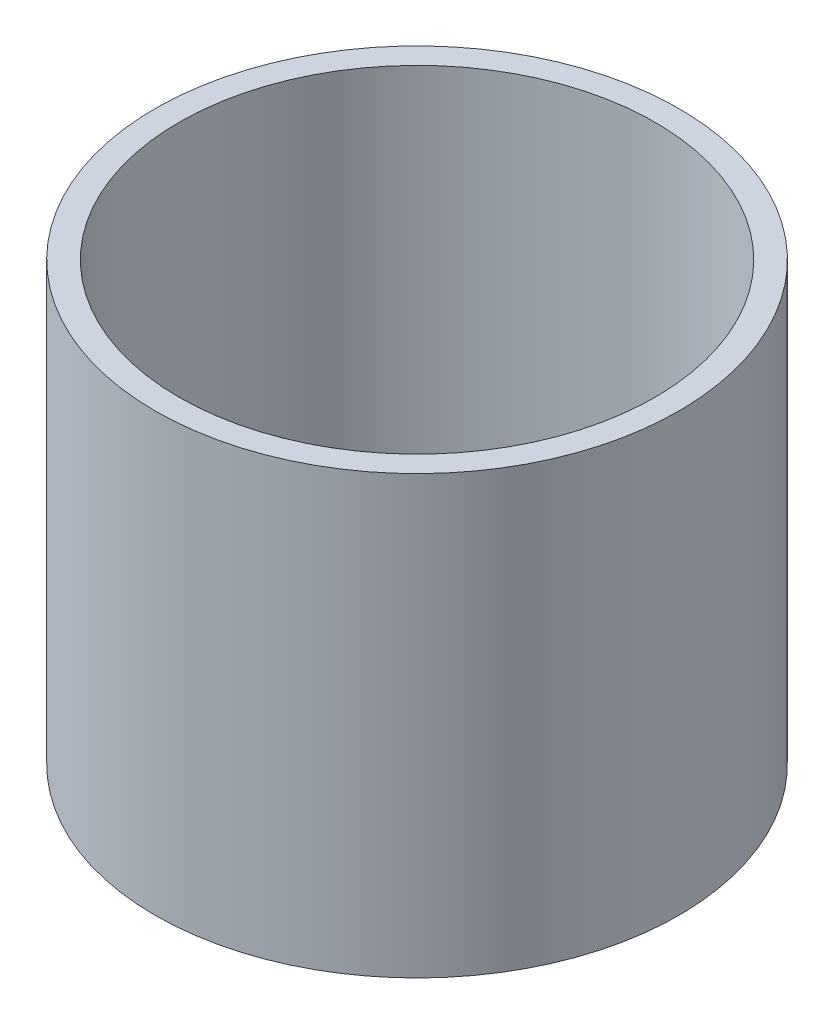
ISO-10303-21;
HEADER;
FILE_DESCRIPTION(('STEP AP214'),'2;1');
FILE_NAME('part.step','',(''),(''),'','','');
FILE_SCHEMA(('AUTOMOTIVE_DESIGN { 1 0 10303 214 1 1 1 1 }'));
ENDSEC;
DATA;
#1=APPLICATION_CONTEXT('core data for automotive mechanical design processes');
#2=APPLICATION_PROTOCOL_DEFINITION('international standard','automotive_design',2000,#1);
#3=PRODUCT_CONTEXT('',#1,'mechanical');
#4=PRODUCT('Part','Part','',(#3));
#5=PRODUCT_RELATED_PRODUCT_CATEGORY('part','',(#4));
#6=PRODUCT_DEFINITION_FORMATION('','',#4);
#7=PRODUCT_DEFINITION_CONTEXT('part definition',#1,'design');
#8=PRODUCT_DEFINITION('design','',#6,#7);
#9=PRODUCT_DEFINITION_SHAPE('','',#8);
#10=(LENGTH_UNIT() NAMED_UNIT(*) SI_UNIT(.MILLI.,.METRE.));
#11=(NAMED_UNIT(*) PLANE_ANGLE_UNIT() SI_UNIT($,.RADIAN.));
#12=(NAMED_UNIT(*) SI_UNIT($,.STERADIAN.) SOLID_ANGLE_UNIT());
#13=UNCERTAINTY_MEASURE_WITH_UNIT(LENGTH_MEASURE(1.E-05),#10,'distance_accuracy_value','');
#14=(GEOMETRIC_REPRESENTATION_CONTEXT(3) GLOBAL_UNCERTAINTY_ASSIGNED_CONTEXT((#13)) GLOBAL_UNIT_ASSIGNED_CONTEXT((#10,
#11,#12)) REPRESENTATION_CONTEXT('',''));
#15=CARTESIAN_POINT('',(0.,0.,0.));
#16=DIRECTION('',(0.,0.,1.));
#17=DIRECTION('',(1.,0.,0.));
#18=AXIS2_PLACEMENT_3D('',#15,#16,#17);
#19=CARTESIAN_POINT('',(0.,46.6,0.));
#20=DIRECTION('',(0.,1.,0.));
#21=DIRECTION('',(0.,0.,1.));
#22=AXIS2_PLACEMENT_3D('',#19,#20,#21);
#23=PLANE('',#22);
#24=CARTESIAN_POINT('',(0.,46.6,0.));
#25=DIRECTION('',(0.,1.,0.));
#26=DIRECTION('',(0.,0.,1.));
#27=AXIS2_PLACEMENT_3D('',#24,#25,#26);
#28=CIRCLE('',#27,27.94);
#29=CARTESIAN_POINT('',(0.,46.6,27.94));
#30=VERTEX_POINT('',#29);
#31=EDGE_CURVE('E10',#30,#30,#28,.T.);
#32=ORIENTED_EDGE('',*,*,#31,.T.);
#33=EDGE_LOOP('',(#32));
#34=FACE_BOUND('',#33,.T.);
#35=CARTESIAN_POINT('',(0.,46.6,0.));
#36=DIRECTION('',(0.,1.,0.));
#37=DIRECTION('',(0.,0.,1.));
#38=AXIS2_PLACEMENT_3D('',#35,#36,#37);
#39=CIRCLE('',#38,25.4);
#40=CARTESIAN_POINT('',(0.,46.6,25.4));
#41=VERTEX_POINT('',#40);
#42=EDGE_CURVE('E42',#41,#41,#39,.T.);
#43=ORIENTED_EDGE('',*,*,#42,.F.);
#44=EDGE_LOOP('',(#43));
#45=FACE_BOUND('',#44,.T.);
#46=ADVANCED_FACE('F31',(#34,#45),#23,.T.);
#47=CARTESIAN_POINT('',(0.,0.,0.));
#48=DIRECTION('',(0.,1.,0.));
#49=DIRECTION('',(0.,0.,1.));
#50=AXIS2_PLACEMENT_3D('',#47,#48,#49);
#51=PLANE('',#50);
#52=CARTESIAN_POINT('',(0.,0.,0.));
#53=DIRECTION('',(0.,1.,0.));
#54=DIRECTION('',(0.,0.,1.));
#55=AXIS2_PLACEMENT_3D('',#52,#53,#54);
#56=CIRCLE('',#55,27.94);
#57=CARTESIAN_POINT('',(0.,0.,27.94));
#58=VERTEX_POINT('',#57);
#59=EDGE_CURVE('E35',#58,#58,#56,.T.);
#60=ORIENTED_EDGE('',*,*,#59,.F.);
#61=EDGE_LOOP('',(#60));
#62=FACE_BOUND('',#61,.T.);
#63=CARTESIAN_POINT('',(0.,0.,0.));
#64=DIRECTION('',(0.,1.,0.));
#65=DIRECTION('',(0.,0.,1.));
#66=AXIS2_PLACEMENT_3D('',#63,#64,#65);
#67=CIRCLE('',#66,25.4);
#68=CARTESIAN_POINT('',(0.,0.,25.4));
#69=VERTEX_POINT('',#68);
#70=EDGE_CURVE('E44',#69,#69,#67,.T.);
#71=ORIENTED_EDGE('',*,*,#70,.T.);
#72=EDGE_LOOP('',(#71));
#73=FACE_BOUND('',#72,.T.);
#74=ADVANCED_FACE('F54',(#62,#73),#51,.F.);
#75=CARTESIAN_POINT('',(0.,46.6,0.));
#76=DIRECTION('',(0.,-1.,0.));
#77=DIRECTION('',(0.,0.,-1.));
#78=AXIS2_PLACEMENT_3D('',#75,#76,#77);
#79=CYLINDRICAL_SURFACE('',#78,27.94);
#80=ORIENTED_EDGE('',*,*,#31,.F.);
#81=EDGE_LOOP('',(#80));
#82=FACE_BOUND('',#81,.T.);
#83=ORIENTED_EDGE('',*,*,#59,.T.);
#84=EDGE_LOOP('',(#83));
#85=FACE_BOUND('',#84,.T.);
#86=ADVANCED_FACE('F33',(#82,#85),#79,.T.);
#87=CARTESIAN_POINT('',(0.,46.6,0.));
#88=DIRECTION('',(0.,-1.,0.));
#89=DIRECTION('',(0.,0.,-1.));
#90=AXIS2_PLACEMENT_3D('',#87,#88,#89);
#91=CYLINDRICAL_SURFACE('',#90,25.4);
#92=ORIENTED_EDGE('',*,*,#42,.T.);
#93=EDGE_LOOP('',(#92));
#94=FACE_BOUND('',#93,.T.);
#95=ORIENTED_EDGE('',*,*,#70,.F.);
#96=EDGE_LOOP('',(#95));
#97=FACE_BOUND('',#96,.T.);
#98=ADVANCED_FACE('F50',(#94,#97),#91,.F.);
#99=CLOSED_SHELL('',(#46,#74,#86,#98));
#100=MANIFOLD_SOLID_BREP('B2',#99);
#101=ADVANCED_BREP_SHAPE_REPRESENTATION('',(#18,#100),#14);
#102=SHAPE_DEFINITION_REPRESENTATION(#9,#101);
ENDSEC;
END-ISO-10303-21;
